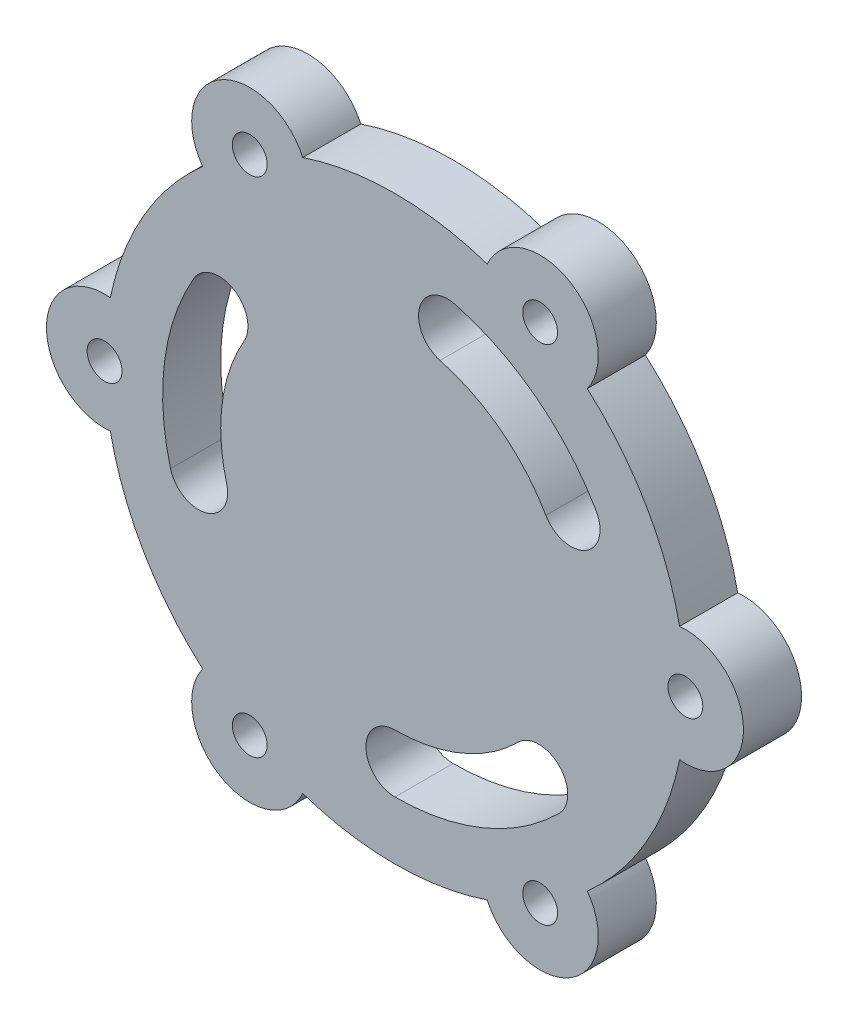
ISO-10303-21;
HEADER;
FILE_DESCRIPTION(('STEP AP214'),'2;1');
FILE_NAME('part.step','',(''),(''),'','','');
FILE_SCHEMA(('AUTOMOTIVE_DESIGN { 1 0 10303 214 1 1 1 1 }'));
ENDSEC;
DATA;
#1=APPLICATION_CONTEXT('core data for automotive mechanical design processes');
#2=APPLICATION_PROTOCOL_DEFINITION('international standard','automotive_design',2000,#1);
#3=PRODUCT_CONTEXT('',#1,'mechanical');
#4=PRODUCT('Part','Part','',(#3));
#5=PRODUCT_RELATED_PRODUCT_CATEGORY('part','',(#4));
#6=PRODUCT_DEFINITION_FORMATION('','',#4);
#7=PRODUCT_DEFINITION_CONTEXT('part definition',#1,'design');
#8=PRODUCT_DEFINITION('design','',#6,#7);
#9=PRODUCT_DEFINITION_SHAPE('','',#8);
#10=(LENGTH_UNIT() NAMED_UNIT(*) SI_UNIT(.MILLI.,.METRE.));
#11=(NAMED_UNIT(*) PLANE_ANGLE_UNIT() SI_UNIT($,.RADIAN.));
#12=(NAMED_UNIT(*) SI_UNIT($,.STERADIAN.) SOLID_ANGLE_UNIT());
#13=UNCERTAINTY_MEASURE_WITH_UNIT(LENGTH_MEASURE(1.E-05),#10,'distance_accuracy_value','');
#14=(GEOMETRIC_REPRESENTATION_CONTEXT(3) GLOBAL_UNCERTAINTY_ASSIGNED_CONTEXT((#13)) GLOBAL_UNIT_ASSIGNED_CONTEXT((#10,
#11,#12)) REPRESENTATION_CONTEXT('',''));
#15=CARTESIAN_POINT('',(0.,0.,0.));
#16=DIRECTION('',(0.,0.,1.));
#17=DIRECTION('',(1.,0.,0.));
#18=AXIS2_PLACEMENT_3D('',#15,#16,#17);
#19=CARTESIAN_POINT('',(25.,0.,10.));
#20=DIRECTION('',(0.,0.,1.));
#21=DIRECTION('',(1.,0.,0.));
#22=AXIS2_PLACEMENT_3D('',#19,#20,#21);
#23=PLANE('',#22);
#24=CARTESIAN_POINT('',(-24.9999999999996,43.3012701892222,10.));
#25=DIRECTION('',(0.,0.,1.));
#26=DIRECTION('',(1.,0.,0.));
#27=AXIS2_PLACEMENT_3D('',#24,#25,#26);
#28=CIRCLE('',#27,3.);
#29=CARTESIAN_POINT('',(-21.9999999999996,43.3012701892222,10.));
#30=VERTEX_POINT('',#29);
#31=EDGE_CURVE('E267',#30,#30,#28,.T.);
#32=ORIENTED_EDGE('',*,*,#31,.F.);
#33=EDGE_LOOP('',(#32));
#34=FACE_BOUND('',#33,.T.);
#35=CARTESIAN_POINT('',(-25.0000000000002,-43.3012701892218,10.));
#36=DIRECTION('',(0.,0.,1.));
#37=DIRECTION('',(1.,0.,0.));
#38=AXIS2_PLACEMENT_3D('',#35,#36,#37);
#39=CIRCLE('',#38,3.);
#40=CARTESIAN_POINT('',(-22.0000000000002,-43.3012701892218,10.));
#41=VERTEX_POINT('',#40);
#42=EDGE_CURVE('E279',#41,#41,#39,.T.);
#43=ORIENTED_EDGE('',*,*,#42,.F.);
#44=EDGE_LOOP('',(#43));
#45=FACE_BOUND('',#44,.T.);
#46=CARTESIAN_POINT('',(50.,0.,10.));
#47=DIRECTION('',(0.,0.,1.));
#48=DIRECTION('',(1.,0.,0.));
#49=AXIS2_PLACEMENT_3D('',#46,#47,#48);
#50=CIRCLE('',#49,3.);
#51=CARTESIAN_POINT('',(53.,0.,10.));
#52=VERTEX_POINT('',#51);
#53=EDGE_CURVE('E291',#52,#52,#50,.T.);
#54=ORIENTED_EDGE('',*,*,#53,.F.);
#55=EDGE_LOOP('',(#54));
#56=FACE_BOUND('',#55,.T.);
#57=CARTESIAN_POINT('',(50.,0.,10.));
#58=DIRECTION('',(0.,0.,1.));
#59=DIRECTION('',(1.,0.,0.));
#60=AXIS2_PLACEMENT_3D('',#57,#58,#59);
#61=CIRCLE('',#60,10.0000000000003);
#62=CARTESIAN_POINT('',(48.9999999999999,-9.94987437106651,10.));
#63=VERTEX_POINT('',#62);
#64=CARTESIAN_POINT('',(48.9999999999999,9.94987437106654,10.));
#65=VERTEX_POINT('',#64);
#66=EDGE_CURVE('E328',#63,#65,#61,.T.);
#67=ORIENTED_EDGE('',*,*,#66,.T.);
#68=CARTESIAN_POINT('',(0.,0.,10.));
#69=DIRECTION('',(0.,0.,1.));
#70=DIRECTION('',(1.,0.,0.));
#71=AXIS2_PLACEMENT_3D('',#68,#69,#70);
#72=CIRCLE('',#71,50.);
#73=CARTESIAN_POINT('',(33.1168439698075,37.460307599904,10.));
#74=VERTEX_POINT('',#73);
#75=EDGE_CURVE('E331',#65,#74,#72,.T.);
#76=ORIENTED_EDGE('',*,*,#75,.T.);
#77=CARTESIAN_POINT('',(25.0000000000005,43.3012701892216,10.));
#78=DIRECTION('',(0.,0.,1.));
#79=DIRECTION('',(1.,0.,0.));
#80=AXIS2_PLACEMENT_3D('',#77,#78,#79);
#81=CIRCLE('',#80,10.);
#82=CARTESIAN_POINT('',(15.8831560301935,47.4101819709704,10.));
#83=VERTEX_POINT('',#82);
#84=EDGE_CURVE('E334',#74,#83,#81,.T.);
#85=ORIENTED_EDGE('',*,*,#84,.T.);
#86=CARTESIAN_POINT('',(0.,0.,10.));
#87=DIRECTION('',(0.,0.,1.));
#88=DIRECTION('',(1.,0.,0.));
#89=AXIS2_PLACEMENT_3D('',#86,#87,#88);
#90=CIRCLE('',#89,50.);
#91=CARTESIAN_POINT('',(-15.8831560301925,47.4101819709708,10.));
#92=VERTEX_POINT('',#91);
#93=EDGE_CURVE('E336',#83,#92,#90,.T.);
#94=ORIENTED_EDGE('',*,*,#93,.T.);
#95=CARTESIAN_POINT('',(-24.9999999999996,43.3012701892222,10.));
#96=DIRECTION('',(0.,0.,1.));
#97=DIRECTION('',(1.,0.,0.));
#98=AXIS2_PLACEMENT_3D('',#95,#96,#97);
#99=CIRCLE('',#98,10.);
#100=CARTESIAN_POINT('',(-33.1168439698067,37.4603075999047,10.));
#101=VERTEX_POINT('',#100);
#102=EDGE_CURVE('E338',#92,#101,#99,.T.);
#103=ORIENTED_EDGE('',*,*,#102,.T.);
#104=CARTESIAN_POINT('',(0.,0.,10.));
#105=DIRECTION('',(0.,0.,1.));
#106=DIRECTION('',(1.,0.,0.));
#107=AXIS2_PLACEMENT_3D('',#104,#105,#106);
#108=CIRCLE('',#107,50.);
#109=CARTESIAN_POINT('',(-49.,9.9498743710662,10.));
#110=VERTEX_POINT('',#109);
#111=EDGE_CURVE('E340',#101,#110,#108,.T.);
#112=ORIENTED_EDGE('',*,*,#111,.T.);
#113=CARTESIAN_POINT('',(-50.,0.,10.));
#114=DIRECTION('',(0.,0.,1.));
#115=DIRECTION('',(1.,0.,0.));
#116=AXIS2_PLACEMENT_3D('',#113,#114,#115);
#117=CIRCLE('',#116,10.);
#118=CARTESIAN_POINT('',(-49.,-9.94987437106621,10.));
#119=VERTEX_POINT('',#118);
#120=EDGE_CURVE('E342',#110,#119,#117,.T.);
#121=ORIENTED_EDGE('',*,*,#120,.T.);
#122=CARTESIAN_POINT('',(0.,0.,10.));
#123=DIRECTION('',(0.,0.,1.));
#124=DIRECTION('',(1.,0.,0.));
#125=AXIS2_PLACEMENT_3D('',#122,#123,#124);
#126=CIRCLE('',#125,50.);
#127=CARTESIAN_POINT('',(-33.1168439698072,-37.4603075999042,10.));
#128=VERTEX_POINT('',#127);
#129=EDGE_CURVE('E344',#119,#128,#126,.T.);
#130=ORIENTED_EDGE('',*,*,#129,.T.);
#131=CARTESIAN_POINT('',(-25.0000000000002,-43.3012701892218,10.));
#132=DIRECTION('',(0.,0.,1.));
#133=DIRECTION('',(1.,0.,0.));
#134=AXIS2_PLACEMENT_3D('',#131,#132,#133);
#135=CIRCLE('',#134,10.);
#136=CARTESIAN_POINT('',(-15.8831560301932,-47.4101819709705,10.));
#137=VERTEX_POINT('',#136);
#138=EDGE_CURVE('E346',#128,#137,#135,.T.);
#139=ORIENTED_EDGE('',*,*,#138,.T.);
#140=CARTESIAN_POINT('',(0.,0.,10.));
#141=DIRECTION('',(0.,0.,1.));
#142=DIRECTION('',(1.,0.,0.));
#143=AXIS2_PLACEMENT_3D('',#140,#141,#142);
#144=CIRCLE('',#143,50.);
#145=CARTESIAN_POINT('',(15.8831560301926,-47.4101819709707,10.));
#146=VERTEX_POINT('',#145);
#147=EDGE_CURVE('E348',#137,#146,#144,.T.);
#148=ORIENTED_EDGE('',*,*,#147,.T.);
#149=CARTESIAN_POINT('',(25.,-43.3012701892219,10.));
#150=DIRECTION('',(0.,0.,1.));
#151=DIRECTION('',(1.,0.,0.));
#152=AXIS2_PLACEMENT_3D('',#149,#150,#151);
#153=CIRCLE('',#152,10.0000000000003);
#154=CARTESIAN_POINT('',(33.1168439698073,-37.4603075999042,10.));
#155=VERTEX_POINT('',#154);
#156=EDGE_CURVE('E350',#146,#155,#153,.T.);
#157=ORIENTED_EDGE('',*,*,#156,.T.);
#158=CARTESIAN_POINT('',(0.,0.,10.));
#159=DIRECTION('',(0.,0.,1.));
#160=DIRECTION('',(1.,0.,0.));
#161=AXIS2_PLACEMENT_3D('',#158,#159,#160);
#162=CIRCLE('',#161,50.);
#163=EDGE_CURVE('E352',#155,#63,#162,.T.);
#164=ORIENTED_EDGE('',*,*,#163,.T.);
#165=EDGE_LOOP('',(#67,#76,#85,#94,#103,#112,#121,#130,#139,#148,#157,#164));
#166=FACE_BOUND('',#165,.T.);
#167=CARTESIAN_POINT('',(0.,0.,10.));
#168=DIRECTION('',(0.,0.,-1.));
#169=DIRECTION('',(1.,0.,0.));
#170=AXIS2_PLACEMENT_3D('',#167,#168,#169);
#171=CIRCLE('',#170,30.);
#172=CARTESIAN_POINT('',(7.76457135307581,28.977774788672,10.));
#173=VERTEX_POINT('',#172);
#174=CARTESIAN_POINT('',(25.9807621135331,15.,10.));
#175=VERTEX_POINT('',#174);
#176=EDGE_CURVE('E299',#173,#175,#171,.T.);
#177=ORIENTED_EDGE('',*,*,#176,.F.);
#178=CARTESIAN_POINT('',(9.05866657858831,33.8074039201174,10.));
#179=DIRECTION('',(0.,0.,1.));
#180=DIRECTION('',(1.,0.,0.));
#181=AXIS2_PLACEMENT_3D('',#178,#179,#180);
#182=CIRCLE('',#181,5.);
#183=CARTESIAN_POINT('',(10.3527618041011,38.6370330515627,10.));
#184=VERTEX_POINT('',#183);
#185=EDGE_CURVE('E297',#184,#173,#182,.T.);
#186=ORIENTED_EDGE('',*,*,#185,.F.);
#187=CARTESIAN_POINT('',(0.,0.,10.));
#188=DIRECTION('',(0.,0.,1.));
#189=DIRECTION('',(1.,0.,0.));
#190=AXIS2_PLACEMENT_3D('',#187,#188,#189);
#191=CIRCLE('',#190,40.);
#192=CARTESIAN_POINT('',(34.6410161513775,20.0000000000001,10.));
#193=VERTEX_POINT('',#192);
#194=EDGE_CURVE('E305',#193,#184,#191,.T.);
#195=ORIENTED_EDGE('',*,*,#194,.F.);
#196=CARTESIAN_POINT('',(30.3108891324553,17.5,10.));
#197=DIRECTION('',(0.,0.,1.));
#198=DIRECTION('',(1.,0.,0.));
#199=AXIS2_PLACEMENT_3D('',#196,#197,#198);
#200=CIRCLE('',#199,5.);
#201=EDGE_CURVE('E302',#175,#193,#200,.T.);
#202=ORIENTED_EDGE('',*,*,#201,.F.);
#203=EDGE_LOOP('',(#177,#186,#195,#202));
#204=FACE_BOUND('',#203,.T.);
#205=CARTESIAN_POINT('',(25.,-43.3012701892219,10.));
#206=DIRECTION('',(0.,0.,1.));
#207=DIRECTION('',(1.,0.,0.));
#208=AXIS2_PLACEMENT_3D('',#205,#206,#207);
#209=CIRCLE('',#208,2.99999999999997);
#210=CARTESIAN_POINT('',(28.,-43.3012701892219,10.));
#211=VERTEX_POINT('',#210);
#212=EDGE_CURVE('E285',#211,#211,#209,.T.);
#213=ORIENTED_EDGE('',*,*,#212,.F.);
#214=EDGE_LOOP('',(#213));
#215=FACE_BOUND('',#214,.T.);
#216=CARTESIAN_POINT('',(-50.,0.,10.));
#217=DIRECTION('',(0.,0.,1.));
#218=DIRECTION('',(1.,0.,0.));
#219=AXIS2_PLACEMENT_3D('',#216,#217,#218);
#220=CIRCLE('',#219,2.9999999999999);
#221=CARTESIAN_POINT('',(-47.0000000000001,0.,10.));
#222=VERTEX_POINT('',#221);
#223=EDGE_CURVE('E273',#222,#222,#220,.T.);
#224=ORIENTED_EDGE('',*,*,#223,.F.);
#225=EDGE_LOOP('',(#224));
#226=FACE_BOUND('',#225,.T.);
#227=CARTESIAN_POINT('',(25.0000000000005,43.3012701892216,10.));
#228=DIRECTION('',(0.,0.,1.));
#229=DIRECTION('',(1.,0.,0.));
#230=AXIS2_PLACEMENT_3D('',#227,#228,#229);
#231=CIRCLE('',#230,3.);
#232=CARTESIAN_POINT('',(28.0000000000005,43.3012701892216,10.));
#233=VERTEX_POINT('',#232);
#234=EDGE_CURVE('E261',#233,#233,#231,.T.);
#235=ORIENTED_EDGE('',*,*,#234,.F.);
#236=EDGE_LOOP('',(#235));
#237=FACE_BOUND('',#236,.T.);
#238=CARTESIAN_POINT('',(0.,0.,10.));
#239=DIRECTION('',(0.,0.,-1.));
#240=DIRECTION('',(1.,0.,0.));
#241=AXIS2_PLACEMENT_3D('',#238,#239,#240);
#242=CIRCLE('',#241,30.);
#243=CARTESIAN_POINT('',(21.2132034355963,-21.2132034355966,10.));
#244=VERTEX_POINT('',#243);
#245=CARTESIAN_POINT('',(0.,-30.,10.));
#246=VERTEX_POINT('',#245);
#247=EDGE_CURVE('E232',#244,#246,#242,.T.);
#248=ORIENTED_EDGE('',*,*,#247,.F.);
#249=CARTESIAN_POINT('',(24.7487373415291,-24.7487373415292,10.));
#250=DIRECTION('',(0.,0.,1.));
#251=DIRECTION('',(1.,0.,0.));
#252=AXIS2_PLACEMENT_3D('',#249,#250,#251);
#253=CIRCLE('',#252,5.);
#254=CARTESIAN_POINT('',(28.2842712474617,-28.2842712474621,10.));
#255=VERTEX_POINT('',#254);
#256=EDGE_CURVE('E230',#255,#244,#253,.T.);
#257=ORIENTED_EDGE('',*,*,#256,.F.);
#258=CARTESIAN_POINT('',(0.,0.,10.));
#259=DIRECTION('',(0.,0.,1.));
#260=DIRECTION('',(1.,0.,0.));
#261=AXIS2_PLACEMENT_3D('',#258,#259,#260);
#262=CIRCLE('',#261,40.);
#263=CARTESIAN_POINT('',(-1.31439079431855E-13,-40.,10.));
#264=VERTEX_POINT('',#263);
#265=EDGE_CURVE('E238',#264,#255,#262,.T.);
#266=ORIENTED_EDGE('',*,*,#265,.F.);
#267=CARTESIAN_POINT('',(-1.12757025938492E-13,-35.,10.));
#268=DIRECTION('',(0.,0.,1.));
#269=DIRECTION('',(1.,0.,0.));
#270=AXIS2_PLACEMENT_3D('',#267,#268,#269);
#271=CIRCLE('',#270,5.);
#272=EDGE_CURVE('E235',#246,#264,#271,.T.);
#273=ORIENTED_EDGE('',*,*,#272,.F.);
#274=EDGE_LOOP('',(#248,#257,#266,#273));
#275=FACE_BOUND('',#274,.T.);
#276=CARTESIAN_POINT('',(0.,0.,10.));
#277=DIRECTION('',(0.,0.,-1.));
#278=DIRECTION('',(1.,0.,0.));
#279=AXIS2_PLACEMENT_3D('',#276,#277,#278);
#280=CIRCLE('',#279,30.);
#281=CARTESIAN_POINT('',(-28.9777747886721,-7.76457135307544,10.));
#282=VERTEX_POINT('',#281);
#283=CARTESIAN_POINT('',(-25.980762113533,15.0000000000002,10.));
#284=VERTEX_POINT('',#283);
#285=EDGE_CURVE('E202',#282,#284,#280,.T.);
#286=ORIENTED_EDGE('',*,*,#285,.F.);
#287=CARTESIAN_POINT('',(-33.8074039201175,-9.05866657858803,10.));
#288=DIRECTION('',(0.,0.,1.));
#289=DIRECTION('',(1.,0.,0.));
#290=AXIS2_PLACEMENT_3D('',#287,#288,#289);
#291=CIRCLE('',#290,5.);
#292=CARTESIAN_POINT('',(-38.6370330515628,-10.3527618041006,10.));
#293=VERTEX_POINT('',#292);
#294=EDGE_CURVE('E194',#293,#282,#291,.T.);
#295=ORIENTED_EDGE('',*,*,#294,.F.);
#296=CARTESIAN_POINT('',(0.,0.,10.));
#297=DIRECTION('',(0.,0.,1.));
#298=DIRECTION('',(1.,0.,0.));
#299=AXIS2_PLACEMENT_3D('',#296,#297,#298);
#300=CIRCLE('',#299,40.);
#301=CARTESIAN_POINT('',(-34.6410161513774,20.0000000000003,10.));
#302=VERTEX_POINT('',#301);
#303=EDGE_CURVE('E216',#302,#293,#300,.T.);
#304=ORIENTED_EDGE('',*,*,#303,.F.);
#305=CARTESIAN_POINT('',(-30.3108891324554,17.5,10.));
#306=DIRECTION('',(0.,0.,1.));
#307=DIRECTION('',(1.,0.,0.));
#308=AXIS2_PLACEMENT_3D('',#305,#306,#307);
#309=CIRCLE('',#308,5.);
#310=EDGE_CURVE('E214',#284,#302,#309,.T.);
#311=ORIENTED_EDGE('',*,*,#310,.F.);
#312=EDGE_LOOP('',(#286,#295,#304,#311));
#313=FACE_BOUND('',#312,.T.);
#314=ADVANCED_FACE('F33',(#34,#45,#56,#166,#204,#215,#226,#237,#275,#313),#23,.T.);
#315=CARTESIAN_POINT('',(25.,0.,0.));
#316=DIRECTION('',(0.,0.,1.));
#317=DIRECTION('',(1.,0.,0.));
#318=AXIS2_PLACEMENT_3D('',#315,#316,#317);
#319=PLANE('',#318);
#320=CARTESIAN_POINT('',(24.7487373415291,-24.7487373415292,0.));
#321=DIRECTION('',(0.,0.,1.));
#322=DIRECTION('',(1.,0.,0.));
#323=AXIS2_PLACEMENT_3D('',#320,#321,#322);
#324=CIRCLE('',#323,5.);
#325=CARTESIAN_POINT('',(28.2842712474617,-28.2842712474621,0.));
#326=VERTEX_POINT('',#325);
#327=CARTESIAN_POINT('',(21.2132034355963,-21.2132034355966,0.));
#328=VERTEX_POINT('',#327);
#329=EDGE_CURVE('E210',#326,#328,#324,.T.);
#330=ORIENTED_EDGE('',*,*,#329,.T.);
#331=CARTESIAN_POINT('',(0.,0.,0.));
#332=DIRECTION('',(0.,0.,-1.));
#333=DIRECTION('',(1.,0.,0.));
#334=AXIS2_PLACEMENT_3D('',#331,#332,#333);
#335=CIRCLE('',#334,30.);
#336=CARTESIAN_POINT('',(0.,-30.,0.));
#337=VERTEX_POINT('',#336);
#338=EDGE_CURVE('E243',#328,#337,#335,.T.);
#339=ORIENTED_EDGE('',*,*,#338,.T.);
#340=CARTESIAN_POINT('',(-1.12757025938492E-13,-35.,0.));
#341=DIRECTION('',(0.,0.,1.));
#342=DIRECTION('',(1.,0.,0.));
#343=AXIS2_PLACEMENT_3D('',#340,#341,#342);
#344=CIRCLE('',#343,5.);
#345=CARTESIAN_POINT('',(-1.31439079431855E-13,-40.,0.));
#346=VERTEX_POINT('',#345);
#347=EDGE_CURVE('E246',#337,#346,#344,.T.);
#348=ORIENTED_EDGE('',*,*,#347,.T.);
#349=CARTESIAN_POINT('',(0.,0.,0.));
#350=DIRECTION('',(0.,0.,1.));
#351=DIRECTION('',(1.,0.,0.));
#352=AXIS2_PLACEMENT_3D('',#349,#350,#351);
#353=CIRCLE('',#352,40.);
#354=EDGE_CURVE('E233',#346,#326,#353,.T.);
#355=ORIENTED_EDGE('',*,*,#354,.T.);
#356=EDGE_LOOP('',(#330,#339,#348,#355));
#357=FACE_BOUND('',#356,.T.);
#358=CARTESIAN_POINT('',(50.,0.,0.));
#359=DIRECTION('',(0.,0.,1.));
#360=DIRECTION('',(1.,0.,0.));
#361=AXIS2_PLACEMENT_3D('',#358,#359,#360);
#362=CIRCLE('',#361,10.0000000000003);
#363=CARTESIAN_POINT('',(48.9999999999999,-9.94987437106651,0.));
#364=VERTEX_POINT('',#363);
#365=CARTESIAN_POINT('',(48.9999999999999,9.94987437106654,0.));
#366=VERTEX_POINT('',#365);
#367=EDGE_CURVE('E327',#364,#366,#362,.T.);
#368=ORIENTED_EDGE('',*,*,#367,.F.);
#369=CARTESIAN_POINT('',(0.,0.,0.));
#370=DIRECTION('',(0.,0.,1.));
#371=DIRECTION('',(1.,0.,0.));
#372=AXIS2_PLACEMENT_3D('',#369,#370,#371);
#373=CIRCLE('',#372,50.);
#374=CARTESIAN_POINT('',(33.1168439698073,-37.4603075999042,0.));
#375=VERTEX_POINT('',#374);
#376=EDGE_CURVE('E332',#375,#364,#373,.T.);
#377=ORIENTED_EDGE('',*,*,#376,.F.);
#378=CARTESIAN_POINT('',(25.,-43.3012701892219,0.));
#379=DIRECTION('',(0.,0.,1.));
#380=DIRECTION('',(1.,0.,0.));
#381=AXIS2_PLACEMENT_3D('',#378,#379,#380);
#382=CIRCLE('',#381,10.0000000000003);
#383=CARTESIAN_POINT('',(15.8831560301926,-47.4101819709707,0.));
#384=VERTEX_POINT('',#383);
#385=EDGE_CURVE('E375',#384,#375,#382,.T.);
#386=ORIENTED_EDGE('',*,*,#385,.F.);
#387=CARTESIAN_POINT('',(0.,0.,0.));
#388=DIRECTION('',(0.,0.,1.));
#389=DIRECTION('',(1.,0.,0.));
#390=AXIS2_PLACEMENT_3D('',#387,#388,#389);
#391=CIRCLE('',#390,50.);
#392=CARTESIAN_POINT('',(-15.8831560301932,-47.4101819709705,0.));
#393=VERTEX_POINT('',#392);
#394=EDGE_CURVE('E373',#393,#384,#391,.T.);
#395=ORIENTED_EDGE('',*,*,#394,.F.);
#396=CARTESIAN_POINT('',(-25.0000000000002,-43.3012701892218,0.));
#397=DIRECTION('',(0.,0.,1.));
#398=DIRECTION('',(1.,0.,0.));
#399=AXIS2_PLACEMENT_3D('',#396,#397,#398);
#400=CIRCLE('',#399,10.);
#401=CARTESIAN_POINT('',(-33.1168439698072,-37.4603075999042,0.));
#402=VERTEX_POINT('',#401);
#403=EDGE_CURVE('E371',#402,#393,#400,.T.);
#404=ORIENTED_EDGE('',*,*,#403,.F.);
#405=CARTESIAN_POINT('',(0.,0.,0.));
#406=DIRECTION('',(0.,0.,1.));
#407=DIRECTION('',(1.,0.,0.));
#408=AXIS2_PLACEMENT_3D('',#405,#406,#407);
#409=CIRCLE('',#408,50.);
#410=CARTESIAN_POINT('',(-49.,-9.94987437106621,0.));
#411=VERTEX_POINT('',#410);
#412=EDGE_CURVE('E369',#411,#402,#409,.T.);
#413=ORIENTED_EDGE('',*,*,#412,.F.);
#414=CARTESIAN_POINT('',(-50.,0.,0.));
#415=DIRECTION('',(0.,0.,1.));
#416=DIRECTION('',(1.,0.,0.));
#417=AXIS2_PLACEMENT_3D('',#414,#415,#416);
#418=CIRCLE('',#417,10.);
#419=CARTESIAN_POINT('',(-49.,9.9498743710662,0.));
#420=VERTEX_POINT('',#419);
#421=EDGE_CURVE('E367',#420,#411,#418,.T.);
#422=ORIENTED_EDGE('',*,*,#421,.F.);
#423=CARTESIAN_POINT('',(0.,0.,0.));
#424=DIRECTION('',(0.,0.,1.));
#425=DIRECTION('',(1.,0.,0.));
#426=AXIS2_PLACEMENT_3D('',#423,#424,#425);
#427=CIRCLE('',#426,50.);
#428=CARTESIAN_POINT('',(-33.1168439698067,37.4603075999047,0.));
#429=VERTEX_POINT('',#428);
#430=EDGE_CURVE('E365',#429,#420,#427,.T.);
#431=ORIENTED_EDGE('',*,*,#430,.F.);
#432=CARTESIAN_POINT('',(-24.9999999999996,43.3012701892222,0.));
#433=DIRECTION('',(0.,0.,1.));
#434=DIRECTION('',(1.,0.,0.));
#435=AXIS2_PLACEMENT_3D('',#432,#433,#434);
#436=CIRCLE('',#435,10.);
#437=CARTESIAN_POINT('',(-15.8831560301925,47.4101819709708,0.));
#438=VERTEX_POINT('',#437);
#439=EDGE_CURVE('E363',#438,#429,#436,.T.);
#440=ORIENTED_EDGE('',*,*,#439,.F.);
#441=CARTESIAN_POINT('',(0.,0.,0.));
#442=DIRECTION('',(0.,0.,1.));
#443=DIRECTION('',(1.,0.,0.));
#444=AXIS2_PLACEMENT_3D('',#441,#442,#443);
#445=CIRCLE('',#444,50.);
#446=CARTESIAN_POINT('',(15.8831560301935,47.4101819709704,0.));
#447=VERTEX_POINT('',#446);
#448=EDGE_CURVE('E361',#447,#438,#445,.T.);
#449=ORIENTED_EDGE('',*,*,#448,.F.);
#450=CARTESIAN_POINT('',(25.0000000000005,43.3012701892216,0.));
#451=DIRECTION('',(0.,0.,1.));
#452=DIRECTION('',(1.,0.,0.));
#453=AXIS2_PLACEMENT_3D('',#450,#451,#452);
#454=CIRCLE('',#453,10.);
#455=CARTESIAN_POINT('',(33.1168439698075,37.460307599904,0.));
#456=VERTEX_POINT('',#455);
#457=EDGE_CURVE('E359',#456,#447,#454,.T.);
#458=ORIENTED_EDGE('',*,*,#457,.F.);
#459=CARTESIAN_POINT('',(0.,0.,0.));
#460=DIRECTION('',(0.,0.,1.));
#461=DIRECTION('',(1.,0.,0.));
#462=AXIS2_PLACEMENT_3D('',#459,#460,#461);
#463=CIRCLE('',#462,50.);
#464=EDGE_CURVE('E357',#366,#456,#463,.T.);
#465=ORIENTED_EDGE('',*,*,#464,.F.);
#466=EDGE_LOOP('',(#368,#377,#386,#395,#404,#413,#422,#431,#440,#449,#458,#465));
#467=FACE_BOUND('',#466,.T.);
#468=CARTESIAN_POINT('',(9.05866657858831,33.8074039201174,0.));
#469=DIRECTION('',(0.,0.,1.));
#470=DIRECTION('',(1.,0.,0.));
#471=AXIS2_PLACEMENT_3D('',#468,#469,#470);
#472=CIRCLE('',#471,5.);
#473=CARTESIAN_POINT('',(10.3527618041011,38.6370330515627,0.));
#474=VERTEX_POINT('',#473);
#475=CARTESIAN_POINT('',(7.76457135307581,28.977774788672,0.));
#476=VERTEX_POINT('',#475);
#477=EDGE_CURVE('E294',#474,#476,#472,.T.);
#478=ORIENTED_EDGE('',*,*,#477,.T.);
#479=CARTESIAN_POINT('',(0.,0.,0.));
#480=DIRECTION('',(0.,0.,-1.));
#481=DIRECTION('',(1.,0.,0.));
#482=AXIS2_PLACEMENT_3D('',#479,#480,#481);
#483=CIRCLE('',#482,30.);
#484=CARTESIAN_POINT('',(25.9807621135331,15.,0.));
#485=VERTEX_POINT('',#484);
#486=EDGE_CURVE('E310',#476,#485,#483,.T.);
#487=ORIENTED_EDGE('',*,*,#486,.T.);
#488=CARTESIAN_POINT('',(30.3108891324553,17.5,0.));
#489=DIRECTION('',(0.,0.,1.));
#490=DIRECTION('',(1.,0.,0.));
#491=AXIS2_PLACEMENT_3D('',#488,#489,#490);
#492=CIRCLE('',#491,5.);
#493=CARTESIAN_POINT('',(34.6410161513775,20.0000000000001,0.));
#494=VERTEX_POINT('',#493);
#495=EDGE_CURVE('E313',#485,#494,#492,.T.);
#496=ORIENTED_EDGE('',*,*,#495,.T.);
#497=CARTESIAN_POINT('',(0.,0.,0.));
#498=DIRECTION('',(0.,0.,1.));
#499=DIRECTION('',(1.,0.,0.));
#500=AXIS2_PLACEMENT_3D('',#497,#498,#499);
#501=CIRCLE('',#500,40.);
#502=EDGE_CURVE('E300',#494,#474,#501,.T.);
#503=ORIENTED_EDGE('',*,*,#502,.T.);
#504=EDGE_LOOP('',(#478,#487,#496,#503));
#505=FACE_BOUND('',#504,.T.);
#506=CARTESIAN_POINT('',(50.,0.,0.));
#507=DIRECTION('',(0.,0.,1.));
#508=DIRECTION('',(1.,0.,0.));
#509=AXIS2_PLACEMENT_3D('',#506,#507,#508);
#510=CIRCLE('',#509,3.);
#511=CARTESIAN_POINT('',(53.,0.,0.));
#512=VERTEX_POINT('',#511);
#513=EDGE_CURVE('E288',#512,#512,#510,.T.);
#514=ORIENTED_EDGE('',*,*,#513,.T.);
#515=EDGE_LOOP('',(#514));
#516=FACE_BOUND('',#515,.T.);
#517=CARTESIAN_POINT('',(25.,-43.3012701892219,0.));
#518=DIRECTION('',(0.,0.,1.));
#519=DIRECTION('',(1.,0.,0.));
#520=AXIS2_PLACEMENT_3D('',#517,#518,#519);
#521=CIRCLE('',#520,2.99999999999997);
#522=CARTESIAN_POINT('',(28.,-43.3012701892219,0.));
#523=VERTEX_POINT('',#522);
#524=EDGE_CURVE('E282',#523,#523,#521,.T.);
#525=ORIENTED_EDGE('',*,*,#524,.T.);
#526=EDGE_LOOP('',(#525));
#527=FACE_BOUND('',#526,.T.);
#528=CARTESIAN_POINT('',(-25.0000000000002,-43.3012701892218,0.));
#529=DIRECTION('',(0.,0.,1.));
#530=DIRECTION('',(1.,0.,0.));
#531=AXIS2_PLACEMENT_3D('',#528,#529,#530);
#532=CIRCLE('',#531,3.);
#533=CARTESIAN_POINT('',(-22.0000000000002,-43.3012701892218,0.));
#534=VERTEX_POINT('',#533);
#535=EDGE_CURVE('E276',#534,#534,#532,.T.);
#536=ORIENTED_EDGE('',*,*,#535,.T.);
#537=EDGE_LOOP('',(#536));
#538=FACE_BOUND('',#537,.T.);
#539=CARTESIAN_POINT('',(-50.,0.,0.));
#540=DIRECTION('',(0.,0.,1.));
#541=DIRECTION('',(1.,0.,0.));
#542=AXIS2_PLACEMENT_3D('',#539,#540,#541);
#543=CIRCLE('',#542,2.9999999999999);
#544=CARTESIAN_POINT('',(-47.0000000000001,0.,0.));
#545=VERTEX_POINT('',#544);
#546=EDGE_CURVE('E270',#545,#545,#543,.T.);
#547=ORIENTED_EDGE('',*,*,#546,.T.);
#548=EDGE_LOOP('',(#547));
#549=FACE_BOUND('',#548,.T.);
#550=CARTESIAN_POINT('',(-24.9999999999996,43.3012701892222,0.));
#551=DIRECTION('',(0.,0.,1.));
#552=DIRECTION('',(1.,0.,0.));
#553=AXIS2_PLACEMENT_3D('',#550,#551,#552);
#554=CIRCLE('',#553,3.);
#555=CARTESIAN_POINT('',(-21.9999999999996,43.3012701892222,0.));
#556=VERTEX_POINT('',#555);
#557=EDGE_CURVE('E264',#556,#556,#554,.T.);
#558=ORIENTED_EDGE('',*,*,#557,.T.);
#559=EDGE_LOOP('',(#558));
#560=FACE_BOUND('',#559,.T.);
#561=CARTESIAN_POINT('',(25.0000000000005,43.3012701892216,0.));
#562=DIRECTION('',(0.,0.,1.));
#563=DIRECTION('',(1.,0.,0.));
#564=AXIS2_PLACEMENT_3D('',#561,#562,#563);
#565=CIRCLE('',#564,3.);
#566=CARTESIAN_POINT('',(28.0000000000005,43.3012701892216,0.));
#567=VERTEX_POINT('',#566);
#568=EDGE_CURVE('E260',#567,#567,#565,.T.);
#569=ORIENTED_EDGE('',*,*,#568,.T.);
#570=EDGE_LOOP('',(#569));
#571=FACE_BOUND('',#570,.T.);
#572=CARTESIAN_POINT('',(-33.8074039201175,-9.05866657858803,0.));
#573=DIRECTION('',(0.,0.,1.));
#574=DIRECTION('',(1.,0.,0.));
#575=AXIS2_PLACEMENT_3D('',#572,#573,#574);
#576=CIRCLE('',#575,5.);
#577=CARTESIAN_POINT('',(-38.6370330515628,-10.3527618041006,0.));
#578=VERTEX_POINT('',#577);
#579=CARTESIAN_POINT('',(-28.9777747886721,-7.76457135307544,0.));
#580=VERTEX_POINT('',#579);
#581=EDGE_CURVE('E56',#578,#580,#576,.T.);
#582=ORIENTED_EDGE('',*,*,#581,.T.);
#583=CARTESIAN_POINT('',(0.,0.,0.));
#584=DIRECTION('',(0.,0.,-1.));
#585=DIRECTION('',(1.,0.,0.));
#586=AXIS2_PLACEMENT_3D('',#583,#584,#585);
#587=CIRCLE('',#586,30.);
#588=CARTESIAN_POINT('',(-25.980762113533,15.0000000000002,0.));
#589=VERTEX_POINT('',#588);
#590=EDGE_CURVE('E209',#580,#589,#587,.T.);
#591=ORIENTED_EDGE('',*,*,#590,.T.);
#592=CARTESIAN_POINT('',(-30.3108891324554,17.5,0.));
#593=DIRECTION('',(0.,0.,1.));
#594=DIRECTION('',(1.,0.,0.));
#595=AXIS2_PLACEMENT_3D('',#592,#593,#594);
#596=CIRCLE('',#595,5.);
#597=CARTESIAN_POINT('',(-34.6410161513774,20.0000000000003,0.));
#598=VERTEX_POINT('',#597);
#599=EDGE_CURVE('E222',#589,#598,#596,.T.);
#600=ORIENTED_EDGE('',*,*,#599,.T.);
#601=CARTESIAN_POINT('',(0.,0.,0.));
#602=DIRECTION('',(0.,0.,1.));
#603=DIRECTION('',(1.,0.,0.));
#604=AXIS2_PLACEMENT_3D('',#601,#602,#603);
#605=CIRCLE('',#604,40.);
#606=EDGE_CURVE('E203',#598,#578,#605,.T.);
#607=ORIENTED_EDGE('',*,*,#606,.T.);
#608=EDGE_LOOP('',(#582,#591,#600,#607));
#609=FACE_BOUND('',#608,.T.);
#610=ADVANCED_FACE('F417',(#357,#467,#505,#516,#527,#538,#549,#560,#571,#609),#319,.F.);
#611=CARTESIAN_POINT('',(50.,0.,10.));
#612=DIRECTION('',(0.,0.,-1.));
#613=DIRECTION('',(-1.,0.,0.));
#614=AXIS2_PLACEMENT_3D('',#611,#612,#613);
#615=CYLINDRICAL_SURFACE('',#614,10.0000000000003);
#616=ORIENTED_EDGE('',*,*,#367,.T.);
#617=DIRECTION('',(0.,0.,-1.));
#618=VECTOR('',#617,1.);
#619=CARTESIAN_POINT('',(48.9999999999999,9.94987437106654,10.));
#620=LINE('',#619,#618);
#621=EDGE_CURVE('E11',#65,#366,#620,.T.);
#622=ORIENTED_EDGE('',*,*,#621,.F.);
#623=ORIENTED_EDGE('',*,*,#66,.F.);
#624=DIRECTION('',(0.,0.,-1.));
#625=VECTOR('',#624,1.);
#626=CARTESIAN_POINT('',(48.9999999999999,-9.94987437106651,10.));
#627=LINE('',#626,#625);
#628=EDGE_CURVE('E354',#63,#364,#627,.T.);
#629=ORIENTED_EDGE('',*,*,#628,.T.);
#630=EDGE_LOOP('',(#616,#622,#623,#629));
#631=FACE_BOUND('',#630,.T.);
#632=ADVANCED_FACE('F35',(#631),#615,.T.);
#633=CARTESIAN_POINT('',(0.,0.,10.));
#634=DIRECTION('',(0.,0.,-1.));
#635=DIRECTION('',(-1.,0.,0.));
#636=AXIS2_PLACEMENT_3D('',#633,#634,#635);
#637=CYLINDRICAL_SURFACE('',#636,50.);
#638=ORIENTED_EDGE('',*,*,#464,.T.);
#639=DIRECTION('',(0.,0.,-1.));
#640=VECTOR('',#639,1.);
#641=CARTESIAN_POINT('',(33.1168439698075,37.460307599904,10.));
#642=LINE('',#641,#640);
#643=EDGE_CURVE('E41',#74,#456,#642,.T.);
#644=ORIENTED_EDGE('',*,*,#643,.F.);
#645=ORIENTED_EDGE('',*,*,#75,.F.);
#646=ORIENTED_EDGE('',*,*,#621,.T.);
#647=EDGE_LOOP('',(#638,#644,#645,#646));
#648=FACE_BOUND('',#647,.T.);
#649=ADVANCED_FACE('F435',(#648),#637,.T.);
#650=CARTESIAN_POINT('',(25.0000000000005,43.3012701892216,10.));
#651=DIRECTION('',(0.,0.,-1.));
#652=DIRECTION('',(-1.,0.,0.));
#653=AXIS2_PLACEMENT_3D('',#650,#651,#652);
#654=CYLINDRICAL_SURFACE('',#653,10.);
#655=ORIENTED_EDGE('',*,*,#457,.T.);
#656=DIRECTION('',(0.,0.,-1.));
#657=VECTOR('',#656,1.);
#658=CARTESIAN_POINT('',(15.8831560301935,47.4101819709704,10.));
#659=LINE('',#658,#657);
#660=EDGE_CURVE('E404',#83,#447,#659,.T.);
#661=ORIENTED_EDGE('',*,*,#660,.F.);
#662=ORIENTED_EDGE('',*,*,#84,.F.);
#663=ORIENTED_EDGE('',*,*,#643,.T.);
#664=EDGE_LOOP('',(#655,#661,#662,#663));
#665=FACE_BOUND('',#664,.T.);
#666=ADVANCED_FACE('F411',(#665),#654,.T.);
#667=CARTESIAN_POINT('',(0.,0.,10.));
#668=DIRECTION('',(0.,0.,-1.));
#669=DIRECTION('',(-1.,0.,0.));
#670=AXIS2_PLACEMENT_3D('',#667,#668,#669);
#671=CYLINDRICAL_SURFACE('',#670,50.);
#672=ORIENTED_EDGE('',*,*,#448,.T.);
#673=DIRECTION('',(0.,0.,-1.));
#674=VECTOR('',#673,1.);
#675=CARTESIAN_POINT('',(-15.8831560301925,47.4101819709708,10.));
#676=LINE('',#675,#674);
#677=EDGE_CURVE('E401',#92,#438,#676,.T.);
#678=ORIENTED_EDGE('',*,*,#677,.F.);
#679=ORIENTED_EDGE('',*,*,#93,.F.);
#680=ORIENTED_EDGE('',*,*,#660,.T.);
#681=EDGE_LOOP('',(#672,#678,#679,#680));
#682=FACE_BOUND('',#681,.T.);
#683=ADVANCED_FACE('F423',(#682),#671,.T.);
#684=CARTESIAN_POINT('',(-24.9999999999996,43.3012701892222,10.));
#685=DIRECTION('',(0.,0.,-1.));
#686=DIRECTION('',(-1.,0.,0.));
#687=AXIS2_PLACEMENT_3D('',#684,#685,#686);
#688=CYLINDRICAL_SURFACE('',#687,10.);
#689=ORIENTED_EDGE('',*,*,#439,.T.);
#690=DIRECTION('',(0.,0.,-1.));
#691=VECTOR('',#690,1.);
#692=CARTESIAN_POINT('',(-33.1168439698067,37.4603075999047,10.));
#693=LINE('',#692,#691);
#694=EDGE_CURVE('E398',#101,#429,#693,.T.);
#695=ORIENTED_EDGE('',*,*,#694,.F.);
#696=ORIENTED_EDGE('',*,*,#102,.F.);
#697=ORIENTED_EDGE('',*,*,#677,.T.);
#698=EDGE_LOOP('',(#689,#695,#696,#697));
#699=FACE_BOUND('',#698,.T.);
#700=ADVANCED_FACE('F427',(#699),#688,.T.);
#701=CARTESIAN_POINT('',(0.,0.,10.));
#702=DIRECTION('',(0.,0.,-1.));
#703=DIRECTION('',(-1.,0.,0.));
#704=AXIS2_PLACEMENT_3D('',#701,#702,#703);
#705=CYLINDRICAL_SURFACE('',#704,50.);
#706=ORIENTED_EDGE('',*,*,#430,.T.);
#707=DIRECTION('',(0.,0.,-1.));
#708=VECTOR('',#707,1.);
#709=CARTESIAN_POINT('',(-49.,9.9498743710662,10.));
#710=LINE('',#709,#708);
#711=EDGE_CURVE('E395',#110,#420,#710,.T.);
#712=ORIENTED_EDGE('',*,*,#711,.F.);
#713=ORIENTED_EDGE('',*,*,#111,.F.);
#714=ORIENTED_EDGE('',*,*,#694,.T.);
#715=EDGE_LOOP('',(#706,#712,#713,#714));
#716=FACE_BOUND('',#715,.T.);
#717=ADVANCED_FACE('F468',(#716),#705,.T.);
#718=CARTESIAN_POINT('',(-50.,0.,10.));
#719=DIRECTION('',(0.,0.,-1.));
#720=DIRECTION('',(-1.,0.,0.));
#721=AXIS2_PLACEMENT_3D('',#718,#719,#720);
#722=CYLINDRICAL_SURFACE('',#721,10.);
#723=ORIENTED_EDGE('',*,*,#421,.T.);
#724=DIRECTION('',(0.,0.,-1.));
#725=VECTOR('',#724,1.);
#726=CARTESIAN_POINT('',(-49.,-9.94987437106621,10.));
#727=LINE('',#726,#725);
#728=EDGE_CURVE('E392',#119,#411,#727,.T.);
#729=ORIENTED_EDGE('',*,*,#728,.F.);
#730=ORIENTED_EDGE('',*,*,#120,.F.);
#731=ORIENTED_EDGE('',*,*,#711,.T.);
#732=EDGE_LOOP('',(#723,#729,#730,#731));
#733=FACE_BOUND('',#732,.T.);
#734=ADVANCED_FACE('F466',(#733),#722,.T.);
#735=CARTESIAN_POINT('',(0.,0.,10.));
#736=DIRECTION('',(0.,0.,-1.));
#737=DIRECTION('',(-1.,0.,0.));
#738=AXIS2_PLACEMENT_3D('',#735,#736,#737);
#739=CYLINDRICAL_SURFACE('',#738,50.);
#740=ORIENTED_EDGE('',*,*,#412,.T.);
#741=DIRECTION('',(0.,0.,-1.));
#742=VECTOR('',#741,1.);
#743=CARTESIAN_POINT('',(-33.1168439698072,-37.4603075999042,10.));
#744=LINE('',#743,#742);
#745=EDGE_CURVE('E389',#128,#402,#744,.T.);
#746=ORIENTED_EDGE('',*,*,#745,.F.);
#747=ORIENTED_EDGE('',*,*,#129,.F.);
#748=ORIENTED_EDGE('',*,*,#728,.T.);
#749=EDGE_LOOP('',(#740,#746,#747,#748));
#750=FACE_BOUND('',#749,.T.);
#751=ADVANCED_FACE('F462',(#750),#739,.T.);
#752=CARTESIAN_POINT('',(-25.0000000000002,-43.3012701892218,10.));
#753=DIRECTION('',(0.,0.,-1.));
#754=DIRECTION('',(-1.,0.,0.));
#755=AXIS2_PLACEMENT_3D('',#752,#753,#754);
#756=CYLINDRICAL_SURFACE('',#755,10.);
#757=ORIENTED_EDGE('',*,*,#403,.T.);
#758=DIRECTION('',(0.,0.,-1.));
#759=VECTOR('',#758,1.);
#760=CARTESIAN_POINT('',(-15.8831560301932,-47.4101819709705,10.));
#761=LINE('',#760,#759);
#762=EDGE_CURVE('E386',#137,#393,#761,.T.);
#763=ORIENTED_EDGE('',*,*,#762,.F.);
#764=ORIENTED_EDGE('',*,*,#138,.F.);
#765=ORIENTED_EDGE('',*,*,#745,.T.);
#766=EDGE_LOOP('',(#757,#763,#764,#765));
#767=FACE_BOUND('',#766,.T.);
#768=ADVANCED_FACE('F457',(#767),#756,.T.);
#769=CARTESIAN_POINT('',(0.,0.,10.));
#770=DIRECTION('',(0.,0.,-1.));
#771=DIRECTION('',(-1.,0.,0.));
#772=AXIS2_PLACEMENT_3D('',#769,#770,#771);
#773=CYLINDRICAL_SURFACE('',#772,50.);
#774=ORIENTED_EDGE('',*,*,#394,.T.);
#775=DIRECTION('',(0.,0.,-1.));
#776=VECTOR('',#775,1.);
#777=CARTESIAN_POINT('',(15.8831560301926,-47.4101819709707,10.));
#778=LINE('',#777,#776);
#779=EDGE_CURVE('E383',#146,#384,#778,.T.);
#780=ORIENTED_EDGE('',*,*,#779,.F.);
#781=ORIENTED_EDGE('',*,*,#147,.F.);
#782=ORIENTED_EDGE('',*,*,#762,.T.);
#783=EDGE_LOOP('',(#774,#780,#781,#782));
#784=FACE_BOUND('',#783,.T.);
#785=ADVANCED_FACE('F451',(#784),#773,.T.);
#786=CARTESIAN_POINT('',(25.,-43.3012701892219,10.));
#787=DIRECTION('',(0.,0.,-1.));
#788=DIRECTION('',(-1.,0.,0.));
#789=AXIS2_PLACEMENT_3D('',#786,#787,#788);
#790=CYLINDRICAL_SURFACE('',#789,10.0000000000003);
#791=ORIENTED_EDGE('',*,*,#385,.T.);
#792=DIRECTION('',(0.,0.,-1.));
#793=VECTOR('',#792,1.);
#794=CARTESIAN_POINT('',(33.1168439698073,-37.4603075999042,10.));
#795=LINE('',#794,#793);
#796=EDGE_CURVE('E380',#155,#375,#795,.T.);
#797=ORIENTED_EDGE('',*,*,#796,.F.);
#798=ORIENTED_EDGE('',*,*,#156,.F.);
#799=ORIENTED_EDGE('',*,*,#779,.T.);
#800=EDGE_LOOP('',(#791,#797,#798,#799));
#801=FACE_BOUND('',#800,.T.);
#802=ADVANCED_FACE('F447',(#801),#790,.T.);
#803=CARTESIAN_POINT('',(0.,0.,10.));
#804=DIRECTION('',(0.,0.,-1.));
#805=DIRECTION('',(-1.,0.,0.));
#806=AXIS2_PLACEMENT_3D('',#803,#804,#805);
#807=CYLINDRICAL_SURFACE('',#806,50.);
#808=ORIENTED_EDGE('',*,*,#376,.T.);
#809=ORIENTED_EDGE('',*,*,#628,.F.);
#810=ORIENTED_EDGE('',*,*,#163,.F.);
#811=ORIENTED_EDGE('',*,*,#796,.T.);
#812=EDGE_LOOP('',(#808,#809,#810,#811));
#813=FACE_BOUND('',#812,.T.);
#814=ADVANCED_FACE('F442',(#813),#807,.T.);
#815=CARTESIAN_POINT('',(9.05866657858831,33.8074039201174,10.));
#816=DIRECTION('',(0.,0.,-1.));
#817=DIRECTION('',(-1.,0.,0.));
#818=AXIS2_PLACEMENT_3D('',#815,#816,#817);
#819=CYLINDRICAL_SURFACE('',#818,5.);
#820=ORIENTED_EDGE('',*,*,#477,.F.);
#821=DIRECTION('',(0.,0.,-1.));
#822=VECTOR('',#821,1.);
#823=CARTESIAN_POINT('',(10.3527618041011,38.6370330515627,10.));
#824=LINE('',#823,#822);
#825=EDGE_CURVE('E307',#184,#474,#824,.T.);
#826=ORIENTED_EDGE('',*,*,#825,.F.);
#827=ORIENTED_EDGE('',*,*,#185,.T.);
#828=DIRECTION('',(0.,0.,-1.));
#829=VECTOR('',#828,1.);
#830=CARTESIAN_POINT('',(7.76457135307581,28.977774788672,10.));
#831=LINE('',#830,#829);
#832=EDGE_CURVE('E324',#173,#476,#831,.T.);
#833=ORIENTED_EDGE('',*,*,#832,.T.);
#834=EDGE_LOOP('',(#820,#826,#827,#833));
#835=FACE_BOUND('',#834,.T.);
#836=ADVANCED_FACE('F488',(#835),#819,.F.);
#837=CARTESIAN_POINT('',(0.,0.,10.));
#838=DIRECTION('',(0.,0.,-1.));
#839=DIRECTION('',(-1.,0.,0.));
#840=AXIS2_PLACEMENT_3D('',#837,#838,#839);
#841=CYLINDRICAL_SURFACE('',#840,30.);
#842=ORIENTED_EDGE('',*,*,#486,.F.);
#843=ORIENTED_EDGE('',*,*,#832,.F.);
#844=ORIENTED_EDGE('',*,*,#176,.T.);
#845=DIRECTION('',(0.,0.,-1.));
#846=VECTOR('',#845,1.);
#847=CARTESIAN_POINT('',(25.9807621135331,15.,10.));
#848=LINE('',#847,#846);
#849=EDGE_CURVE('E322',#175,#485,#848,.T.);
#850=ORIENTED_EDGE('',*,*,#849,.T.);
#851=EDGE_LOOP('',(#842,#843,#844,#850));
#852=FACE_BOUND('',#851,.T.);
#853=ADVANCED_FACE('F526',(#852),#841,.T.);
#854=CARTESIAN_POINT('',(30.3108891324553,17.5,10.));
#855=DIRECTION('',(0.,0.,-1.));
#856=DIRECTION('',(-1.,0.,0.));
#857=AXIS2_PLACEMENT_3D('',#854,#855,#856);
#858=CYLINDRICAL_SURFACE('',#857,5.);
#859=ORIENTED_EDGE('',*,*,#495,.F.);
#860=ORIENTED_EDGE('',*,*,#849,.F.);
#861=ORIENTED_EDGE('',*,*,#201,.T.);
#862=DIRECTION('',(0.,0.,-1.));
#863=VECTOR('',#862,1.);
#864=CARTESIAN_POINT('',(34.6410161513775,20.0000000000001,10.));
#865=LINE('',#864,#863);
#866=EDGE_CURVE('E320',#193,#494,#865,.T.);
#867=ORIENTED_EDGE('',*,*,#866,.T.);
#868=EDGE_LOOP('',(#859,#860,#861,#867));
#869=FACE_BOUND('',#868,.T.);
#870=ADVANCED_FACE('F533',(#869),#858,.F.);
#871=CARTESIAN_POINT('',(0.,0.,10.));
#872=DIRECTION('',(0.,0.,-1.));
#873=DIRECTION('',(-1.,0.,0.));
#874=AXIS2_PLACEMENT_3D('',#871,#872,#873);
#875=CYLINDRICAL_SURFACE('',#874,40.);
#876=ORIENTED_EDGE('',*,*,#502,.F.);
#877=ORIENTED_EDGE('',*,*,#866,.F.);
#878=ORIENTED_EDGE('',*,*,#194,.T.);
#879=ORIENTED_EDGE('',*,*,#825,.T.);
#880=EDGE_LOOP('',(#876,#877,#878,#879));
#881=FACE_BOUND('',#880,.T.);
#882=ADVANCED_FACE('F540',(#881),#875,.F.);
#883=CARTESIAN_POINT('',(50.,0.,10.));
#884=DIRECTION('',(0.,0.,-1.));
#885=DIRECTION('',(-1.,0.,0.));
#886=AXIS2_PLACEMENT_3D('',#883,#884,#885);
#887=CYLINDRICAL_SURFACE('',#886,3.);
#888=ORIENTED_EDGE('',*,*,#53,.T.);
#889=EDGE_LOOP('',(#888));
#890=FACE_BOUND('',#889,.T.);
#891=ORIENTED_EDGE('',*,*,#513,.F.);
#892=EDGE_LOOP('',(#891));
#893=FACE_BOUND('',#892,.T.);
#894=ADVANCED_FACE('F548',(#890,#893),#887,.F.);
#895=CARTESIAN_POINT('',(25.,-43.3012701892219,10.));
#896=DIRECTION('',(0.,0.,-1.));
#897=DIRECTION('',(-1.,0.,0.));
#898=AXIS2_PLACEMENT_3D('',#895,#896,#897);
#899=CYLINDRICAL_SURFACE('',#898,2.99999999999997);
#900=ORIENTED_EDGE('',*,*,#212,.T.);
#901=EDGE_LOOP('',(#900));
#902=FACE_BOUND('',#901,.T.);
#903=ORIENTED_EDGE('',*,*,#524,.F.);
#904=EDGE_LOOP('',(#903));
#905=FACE_BOUND('',#904,.T.);
#906=ADVANCED_FACE('F556',(#902,#905),#899,.F.);
#907=CARTESIAN_POINT('',(-25.0000000000002,-43.3012701892218,10.));
#908=DIRECTION('',(0.,0.,-1.));
#909=DIRECTION('',(-1.,0.,0.));
#910=AXIS2_PLACEMENT_3D('',#907,#908,#909);
#911=CYLINDRICAL_SURFACE('',#910,3.);
#912=ORIENTED_EDGE('',*,*,#42,.T.);
#913=EDGE_LOOP('',(#912));
#914=FACE_BOUND('',#913,.T.);
#915=ORIENTED_EDGE('',*,*,#535,.F.);
#916=EDGE_LOOP('',(#915));
#917=FACE_BOUND('',#916,.T.);
#918=ADVANCED_FACE('F564',(#914,#917),#911,.F.);
#919=CARTESIAN_POINT('',(-50.,0.,10.));
#920=DIRECTION('',(0.,0.,-1.));
#921=DIRECTION('',(-1.,0.,0.));
#922=AXIS2_PLACEMENT_3D('',#919,#920,#921);
#923=CYLINDRICAL_SURFACE('',#922,2.9999999999999);
#924=ORIENTED_EDGE('',*,*,#223,.T.);
#925=EDGE_LOOP('',(#924));
#926=FACE_BOUND('',#925,.T.);
#927=ORIENTED_EDGE('',*,*,#546,.F.);
#928=EDGE_LOOP('',(#927));
#929=FACE_BOUND('',#928,.T.);
#930=ADVANCED_FACE('F572',(#926,#929),#923,.F.);
#931=CARTESIAN_POINT('',(-24.9999999999996,43.3012701892222,10.));
#932=DIRECTION('',(0.,0.,-1.));
#933=DIRECTION('',(-1.,0.,0.));
#934=AXIS2_PLACEMENT_3D('',#931,#932,#933);
#935=CYLINDRICAL_SURFACE('',#934,3.);
#936=ORIENTED_EDGE('',*,*,#31,.T.);
#937=EDGE_LOOP('',(#936));
#938=FACE_BOUND('',#937,.T.);
#939=ORIENTED_EDGE('',*,*,#557,.F.);
#940=EDGE_LOOP('',(#939));
#941=FACE_BOUND('',#940,.T.);
#942=ADVANCED_FACE('F580',(#938,#941),#935,.F.);
#943=CARTESIAN_POINT('',(25.0000000000005,43.3012701892216,10.));
#944=DIRECTION('',(0.,0.,-1.));
#945=DIRECTION('',(-1.,0.,0.));
#946=AXIS2_PLACEMENT_3D('',#943,#944,#945);
#947=CYLINDRICAL_SURFACE('',#946,3.);
#948=ORIENTED_EDGE('',*,*,#234,.T.);
#949=EDGE_LOOP('',(#948));
#950=FACE_BOUND('',#949,.T.);
#951=ORIENTED_EDGE('',*,*,#568,.F.);
#952=EDGE_LOOP('',(#951));
#953=FACE_BOUND('',#952,.T.);
#954=ADVANCED_FACE('F588',(#950,#953),#947,.F.);
#955=CARTESIAN_POINT('',(24.7487373415291,-24.7487373415292,10.));
#956=DIRECTION('',(0.,0.,-1.));
#957=DIRECTION('',(-1.,0.,0.));
#958=AXIS2_PLACEMENT_3D('',#955,#956,#957);
#959=CYLINDRICAL_SURFACE('',#958,5.);
#960=ORIENTED_EDGE('',*,*,#329,.F.);
#961=DIRECTION('',(0.,0.,-1.));
#962=VECTOR('',#961,1.);
#963=CARTESIAN_POINT('',(28.2842712474617,-28.2842712474621,10.));
#964=LINE('',#963,#962);
#965=EDGE_CURVE('E240',#255,#326,#964,.T.);
#966=ORIENTED_EDGE('',*,*,#965,.F.);
#967=ORIENTED_EDGE('',*,*,#256,.T.);
#968=DIRECTION('',(0.,0.,-1.));
#969=VECTOR('',#968,1.);
#970=CARTESIAN_POINT('',(21.2132034355963,-21.2132034355966,10.));
#971=LINE('',#970,#969);
#972=EDGE_CURVE('E257',#244,#328,#971,.T.);
#973=ORIENTED_EDGE('',*,*,#972,.T.);
#974=EDGE_LOOP('',(#960,#966,#967,#973));
#975=FACE_BOUND('',#974,.T.);
#976=ADVANCED_FACE('F596',(#975),#959,.F.);
#977=CARTESIAN_POINT('',(0.,0.,10.));
#978=DIRECTION('',(0.,0.,-1.));
#979=DIRECTION('',(-1.,0.,0.));
#980=AXIS2_PLACEMENT_3D('',#977,#978,#979);
#981=CYLINDRICAL_SURFACE('',#980,30.);
#982=ORIENTED_EDGE('',*,*,#338,.F.);
#983=ORIENTED_EDGE('',*,*,#972,.F.);
#984=ORIENTED_EDGE('',*,*,#247,.T.);
#985=DIRECTION('',(0.,0.,-1.));
#986=VECTOR('',#985,1.);
#987=CARTESIAN_POINT('',(0.,-30.,10.));
#988=LINE('',#987,#986);
#989=EDGE_CURVE('E255',#246,#337,#988,.T.);
#990=ORIENTED_EDGE('',*,*,#989,.T.);
#991=EDGE_LOOP('',(#982,#983,#984,#990));
#992=FACE_BOUND('',#991,.T.);
#993=ADVANCED_FACE('F604',(#992),#981,.T.);
#994=CARTESIAN_POINT('',(-1.12757025938492E-13,-35.,10.));
#995=DIRECTION('',(0.,0.,-1.));
#996=DIRECTION('',(-1.,0.,0.));
#997=AXIS2_PLACEMENT_3D('',#994,#995,#996);
#998=CYLINDRICAL_SURFACE('',#997,5.);
#999=ORIENTED_EDGE('',*,*,#347,.F.);
#1000=ORIENTED_EDGE('',*,*,#989,.F.);
#1001=ORIENTED_EDGE('',*,*,#272,.T.);
#1002=DIRECTION('',(0.,0.,-1.));
#1003=VECTOR('',#1002,1.);
#1004=CARTESIAN_POINT('',(-1.31439079431855E-13,-40.,10.));
#1005=LINE('',#1004,#1003);
#1006=EDGE_CURVE('E253',#264,#346,#1005,.T.);
#1007=ORIENTED_EDGE('',*,*,#1006,.T.);
#1008=EDGE_LOOP('',(#999,#1000,#1001,#1007));
#1009=FACE_BOUND('',#1008,.T.);
#1010=ADVANCED_FACE('F612',(#1009),#998,.F.);
#1011=CARTESIAN_POINT('',(0.,0.,10.));
#1012=DIRECTION('',(0.,0.,-1.));
#1013=DIRECTION('',(-1.,0.,0.));
#1014=AXIS2_PLACEMENT_3D('',#1011,#1012,#1013);
#1015=CYLINDRICAL_SURFACE('',#1014,40.);
#1016=ORIENTED_EDGE('',*,*,#354,.F.);
#1017=ORIENTED_EDGE('',*,*,#1006,.F.);
#1018=ORIENTED_EDGE('',*,*,#265,.T.);
#1019=ORIENTED_EDGE('',*,*,#965,.T.);
#1020=EDGE_LOOP('',(#1016,#1017,#1018,#1019));
#1021=FACE_BOUND('',#1020,.T.);
#1022=ADVANCED_FACE('F620',(#1021),#1015,.F.);
#1023=CARTESIAN_POINT('',(-33.8074039201175,-9.05866657858803,10.));
#1024=DIRECTION('',(0.,0.,-1.));
#1025=DIRECTION('',(-1.,0.,0.));
#1026=AXIS2_PLACEMENT_3D('',#1023,#1024,#1025);
#1027=CYLINDRICAL_SURFACE('',#1026,5.);
#1028=ORIENTED_EDGE('',*,*,#581,.F.);
#1029=DIRECTION('',(0.,0.,-1.));
#1030=VECTOR('',#1029,1.);
#1031=CARTESIAN_POINT('',(-38.6370330515628,-10.3527618041006,10.));
#1032=LINE('',#1031,#1030);
#1033=EDGE_CURVE('E198',#293,#578,#1032,.T.);
#1034=ORIENTED_EDGE('',*,*,#1033,.F.);
#1035=ORIENTED_EDGE('',*,*,#294,.T.);
#1036=DIRECTION('',(0.,0.,-1.));
#1037=VECTOR('',#1036,1.);
#1038=CARTESIAN_POINT('',(-28.9777747886721,-7.76457135307544,10.));
#1039=LINE('',#1038,#1037);
#1040=EDGE_CURVE('E197',#282,#580,#1039,.T.);
#1041=ORIENTED_EDGE('',*,*,#1040,.T.);
#1042=EDGE_LOOP('',(#1028,#1034,#1035,#1041));
#1043=FACE_BOUND('',#1042,.T.);
#1044=ADVANCED_FACE('F196',(#1043),#1027,.F.);
#1045=CARTESIAN_POINT('',(0.,0.,10.));
#1046=DIRECTION('',(0.,0.,-1.));
#1047=DIRECTION('',(-1.,0.,0.));
#1048=AXIS2_PLACEMENT_3D('',#1045,#1046,#1047);
#1049=CYLINDRICAL_SURFACE('',#1048,30.);
#1050=ORIENTED_EDGE('',*,*,#590,.F.);
#1051=ORIENTED_EDGE('',*,*,#1040,.F.);
#1052=ORIENTED_EDGE('',*,*,#285,.T.);
#1053=DIRECTION('',(0.,0.,-1.));
#1054=VECTOR('',#1053,1.);
#1055=CARTESIAN_POINT('',(-25.980762113533,15.0000000000002,10.));
#1056=LINE('',#1055,#1054);
#1057=EDGE_CURVE('E211',#284,#589,#1056,.T.);
#1058=ORIENTED_EDGE('',*,*,#1057,.T.);
#1059=EDGE_LOOP('',(#1050,#1051,#1052,#1058));
#1060=FACE_BOUND('',#1059,.T.);
#1061=ADVANCED_FACE('F206',(#1060),#1049,.T.);
#1062=CARTESIAN_POINT('',(-30.3108891324554,17.5,10.));
#1063=DIRECTION('',(0.,0.,-1.));
#1064=DIRECTION('',(-1.,0.,0.));
#1065=AXIS2_PLACEMENT_3D('',#1062,#1063,#1064);
#1066=CYLINDRICAL_SURFACE('',#1065,5.);
#1067=ORIENTED_EDGE('',*,*,#599,.F.);
#1068=ORIENTED_EDGE('',*,*,#1057,.F.);
#1069=ORIENTED_EDGE('',*,*,#310,.T.);
#1070=DIRECTION('',(0.,0.,-1.));
#1071=VECTOR('',#1070,1.);
#1072=CARTESIAN_POINT('',(-34.6410161513774,20.0000000000003,10.));
#1073=LINE('',#1072,#1071);
#1074=EDGE_CURVE('E48',#302,#598,#1073,.T.);
#1075=ORIENTED_EDGE('',*,*,#1074,.T.);
#1076=EDGE_LOOP('',(#1067,#1068,#1069,#1075));
#1077=FACE_BOUND('',#1076,.T.);
#1078=ADVANCED_FACE('F641',(#1077),#1066,.F.);
#1079=CARTESIAN_POINT('',(0.,0.,10.));
#1080=DIRECTION('',(0.,0.,-1.));
#1081=DIRECTION('',(-1.,0.,0.));
#1082=AXIS2_PLACEMENT_3D('',#1079,#1080,#1081);
#1083=CYLINDRICAL_SURFACE('',#1082,40.);
#1084=ORIENTED_EDGE('',*,*,#606,.F.);
#1085=ORIENTED_EDGE('',*,*,#1074,.F.);
#1086=ORIENTED_EDGE('',*,*,#303,.T.);
#1087=ORIENTED_EDGE('',*,*,#1033,.T.);
#1088=EDGE_LOOP('',(#1084,#1085,#1086,#1087));
#1089=FACE_BOUND('',#1088,.T.);
#1090=ADVANCED_FACE('F648',(#1089),#1083,.F.);
#1091=CLOSED_SHELL('',(#314,#610,#632,#649,#666,#683,#700,#717,#734,#751,#768,#785,#802,#814,
#836,#853,#870,#882,#894,#906,#918,#930,#942,#954,#976,#993,#1010,#1022,#1044,#1061,#1078,#1090));
#1092=MANIFOLD_SOLID_BREP('B2',#1091);
#1093=ADVANCED_BREP_SHAPE_REPRESENTATION('',(#18,#1092),#14);
#1094=SHAPE_DEFINITION_REPRESENTATION(#9,#1093);
ENDSEC;
END-ISO-10303-21;
